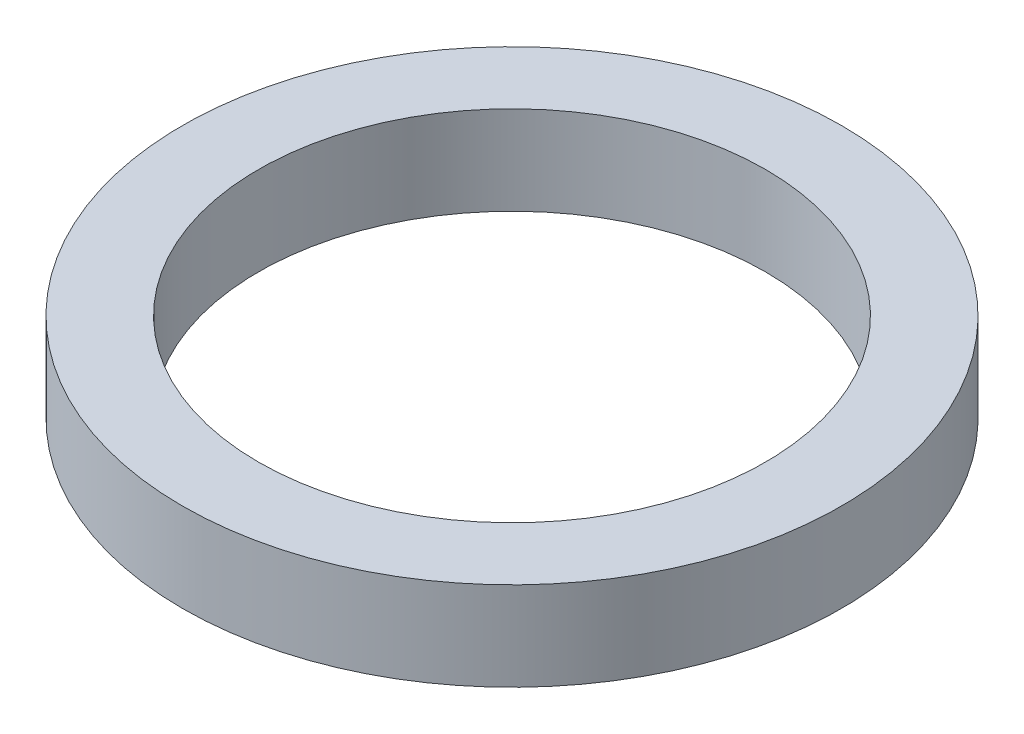
ISO-10303-21;
HEADER;
FILE_DESCRIPTION(('STEP AP214'),'2;1');
FILE_NAME('part.step','',(''),(''),'','','');
FILE_SCHEMA(('AUTOMOTIVE_DESIGN { 1 0 10303 214 1 1 1 1 }'));
ENDSEC;
DATA;
#1=APPLICATION_CONTEXT('core data for automotive mechanical design processes');
#2=APPLICATION_PROTOCOL_DEFINITION('international standard','automotive_design',2000,#1);
#3=PRODUCT_CONTEXT('',#1,'mechanical');
#4=PRODUCT('Part','Part','',(#3));
#5=PRODUCT_RELATED_PRODUCT_CATEGORY('part','',(#4));
#6=PRODUCT_DEFINITION_FORMATION('','',#4);
#7=PRODUCT_DEFINITION_CONTEXT('part definition',#1,'design');
#8=PRODUCT_DEFINITION('design','',#6,#7);
#9=PRODUCT_DEFINITION_SHAPE('','',#8);
#10=(LENGTH_UNIT() NAMED_UNIT(*) SI_UNIT(.MILLI.,.METRE.));
#11=(NAMED_UNIT(*) PLANE_ANGLE_UNIT() SI_UNIT($,.RADIAN.));
#12=(NAMED_UNIT(*) SI_UNIT($,.STERADIAN.) SOLID_ANGLE_UNIT());
#13=UNCERTAINTY_MEASURE_WITH_UNIT(LENGTH_MEASURE(1.E-05),#10,'distance_accuracy_value','');
#14=(GEOMETRIC_REPRESENTATION_CONTEXT(3) GLOBAL_UNCERTAINTY_ASSIGNED_CONTEXT((#13)) GLOBAL_UNIT_ASSIGNED_CONTEXT((#10,
#11,#12)) REPRESENTATION_CONTEXT('',''));
#15=CARTESIAN_POINT('',(0.,0.,0.));
#16=DIRECTION('',(0.,0.,1.));
#17=DIRECTION('',(1.,0.,0.));
#18=AXIS2_PLACEMENT_3D('',#15,#16,#17);
#19=CARTESIAN_POINT('',(0.,7.,0.));
#20=DIRECTION('',(0.,1.,0.));
#21=DIRECTION('',(0.,0.,1.));
#22=AXIS2_PLACEMENT_3D('',#19,#20,#21);
#23=PLANE('',#22);
#24=CARTESIAN_POINT('',(0.,7.,0.));
#25=DIRECTION('',(0.,1.,0.));
#26=DIRECTION('',(0.,0.,1.));
#27=AXIS2_PLACEMENT_3D('',#24,#25,#26);
#28=CIRCLE('',#27,26.);
#29=CARTESIAN_POINT('',(0.,7.,26.));
#30=VERTEX_POINT('',#29);
#31=EDGE_CURVE('E10',#30,#30,#28,.T.);
#32=ORIENTED_EDGE('',*,*,#31,.T.);
#33=EDGE_LOOP('',(#32));
#34=FACE_BOUND('',#33,.T.);
#35=CARTESIAN_POINT('',(0.,7.,0.));
#36=DIRECTION('',(0.,1.,0.));
#37=DIRECTION('',(0.,0.,1.));
#38=AXIS2_PLACEMENT_3D('',#35,#36,#37);
#39=CIRCLE('',#38,20.);
#40=CARTESIAN_POINT('',(0.,7.,20.));
#41=VERTEX_POINT('',#40);
#42=EDGE_CURVE('E44',#41,#41,#39,.T.);
#43=ORIENTED_EDGE('',*,*,#42,.F.);
#44=EDGE_LOOP('',(#43));
#45=FACE_BOUND('',#44,.T.);
#46=ADVANCED_FACE('F33',(#34,#45),#23,.T.);
#47=CARTESIAN_POINT('',(0.,0.,0.));
#48=DIRECTION('',(0.,1.,0.));
#49=DIRECTION('',(0.,0.,1.));
#50=AXIS2_PLACEMENT_3D('',#47,#48,#49);
#51=PLANE('',#50);
#52=CARTESIAN_POINT('',(0.,0.,0.));
#53=DIRECTION('',(0.,1.,0.));
#54=DIRECTION('',(0.,0.,1.));
#55=AXIS2_PLACEMENT_3D('',#52,#53,#54);
#56=CIRCLE('',#55,26.);
#57=CARTESIAN_POINT('',(0.,0.,26.));
#58=VERTEX_POINT('',#57);
#59=EDGE_CURVE('E37',#58,#58,#56,.T.);
#60=ORIENTED_EDGE('',*,*,#59,.F.);
#61=EDGE_LOOP('',(#60));
#62=FACE_BOUND('',#61,.T.);
#63=CARTESIAN_POINT('',(0.,0.,0.));
#64=DIRECTION('',(0.,1.,0.));
#65=DIRECTION('',(0.,0.,1.));
#66=AXIS2_PLACEMENT_3D('',#63,#64,#65);
#67=CIRCLE('',#66,20.);
#68=CARTESIAN_POINT('',(0.,0.,20.));
#69=VERTEX_POINT('',#68);
#70=EDGE_CURVE('E46',#69,#69,#67,.T.);
#71=ORIENTED_EDGE('',*,*,#70,.T.);
#72=EDGE_LOOP('',(#71));
#73=FACE_BOUND('',#72,.T.);
#74=ADVANCED_FACE('F56',(#62,#73),#51,.F.);
#75=CARTESIAN_POINT('',(0.,7.,0.));
#76=DIRECTION('',(0.,-1.,0.));
#77=DIRECTION('',(0.,0.,-1.));
#78=AXIS2_PLACEMENT_3D('',#75,#76,#77);
#79=CYLINDRICAL_SURFACE('',#78,26.);
#80=ORIENTED_EDGE('',*,*,#31,.F.);
#81=EDGE_LOOP('',(#80));
#82=FACE_BOUND('',#81,.T.);
#83=ORIENTED_EDGE('',*,*,#59,.T.);
#84=EDGE_LOOP('',(#83));
#85=FACE_BOUND('',#84,.T.);
#86=ADVANCED_FACE('F35',(#82,#85),#79,.T.);
#87=CARTESIAN_POINT('',(0.,7.,0.));
#88=DIRECTION('',(0.,-1.,0.));
#89=DIRECTION('',(0.,0.,-1.));
#90=AXIS2_PLACEMENT_3D('',#87,#88,#89);
#91=CYLINDRICAL_SURFACE('',#90,20.);
#92=ORIENTED_EDGE('',*,*,#42,.T.);
#93=EDGE_LOOP('',(#92));
#94=FACE_BOUND('',#93,.T.);
#95=ORIENTED_EDGE('',*,*,#70,.F.);
#96=EDGE_LOOP('',(#95));
#97=FACE_BOUND('',#96,.T.);
#98=ADVANCED_FACE('F52',(#94,#97),#91,.F.);
#99=CLOSED_SHELL('',(#46,#74,#86,#98));
#100=MANIFOLD_SOLID_BREP('B2',#99);
#101=ADVANCED_BREP_SHAPE_REPRESENTATION('',(#18,#100),#14);
#102=SHAPE_DEFINITION_REPRESENTATION(#9,#101);
ENDSEC;
END-ISO-10303-21;
